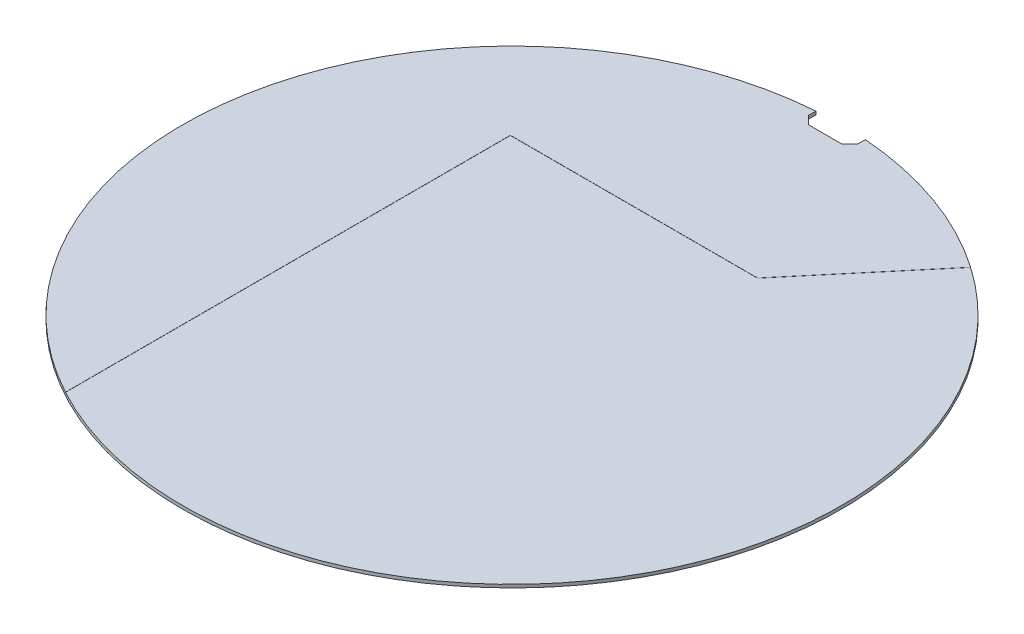
ISO-10303-21;
HEADER;
FILE_DESCRIPTION(('STEP AP214'),'2;1');
FILE_NAME('part.step','',(''),(''),'','','');
FILE_SCHEMA(('AUTOMOTIVE_DESIGN { 1 0 10303 214 1 1 1 1 }'));
ENDSEC;
DATA;
#1=APPLICATION_CONTEXT('core data for automotive mechanical design processes');
#2=APPLICATION_PROTOCOL_DEFINITION('international standard','automotive_design',2000,#1);
#3=PRODUCT_CONTEXT('',#1,'mechanical');
#4=PRODUCT('Part','Part','',(#3));
#5=PRODUCT_RELATED_PRODUCT_CATEGORY('part','',(#4));
#6=PRODUCT_DEFINITION_FORMATION('','',#4);
#7=PRODUCT_DEFINITION_CONTEXT('part definition',#1,'design');
#8=PRODUCT_DEFINITION('design','',#6,#7);
#9=PRODUCT_DEFINITION_SHAPE('','',#8);
#10=(LENGTH_UNIT() NAMED_UNIT(*) SI_UNIT(.MILLI.,.METRE.));
#11=(NAMED_UNIT(*) PLANE_ANGLE_UNIT() SI_UNIT($,.RADIAN.));
#12=(NAMED_UNIT(*) SI_UNIT($,.STERADIAN.) SOLID_ANGLE_UNIT());
#13=UNCERTAINTY_MEASURE_WITH_UNIT(LENGTH_MEASURE(1.E-05),#10,'distance_accuracy_value','');
#14=(GEOMETRIC_REPRESENTATION_CONTEXT(3) GLOBAL_UNCERTAINTY_ASSIGNED_CONTEXT((#13)) GLOBAL_UNIT_ASSIGNED_CONTEXT((#10,
#11,#12)) REPRESENTATION_CONTEXT('',''));
#15=CARTESIAN_POINT('',(0.,0.,0.));
#16=DIRECTION('',(0.,0.,1.));
#17=DIRECTION('',(1.,0.,0.));
#18=AXIS2_PLACEMENT_3D('',#15,#16,#17);
#19=CARTESIAN_POINT('',(0.,0.2,0.));
#20=DIRECTION('',(0.,-1.,0.));
#21=DIRECTION('',(0.,0.,-1.));
#22=AXIS2_PLACEMENT_3D('',#19,#20,#21);
#23=CYLINDRICAL_SURFACE('',#22,20.);
#24=CARTESIAN_POINT('',(0.,0.2,0.));
#25=DIRECTION('',(0.,1.,0.));
#26=DIRECTION('',(0.,0.,1.));
#27=AXIS2_PLACEMENT_3D('',#24,#25,#26);
#28=CIRCLE('',#27,20.);
#29=CARTESIAN_POINT('',(11.4006701364173,0.2,-16.4324289269907));
#30=VERTEX_POINT('',#29);
#31=CARTESIAN_POINT('',(1.49999999999998,0.2,-19.9436706751791));
#32=VERTEX_POINT('',#31);
#33=EDGE_CURVE('E43',#30,#32,#28,.T.);
#34=ORIENTED_EDGE('',*,*,#33,.F.);
#35=DIRECTION('',(0.,1.,0.));
#36=VECTOR('',#35,1.);
#37=CARTESIAN_POINT('',(11.4006701364173,0.19,-16.4324289269907));
#38=LINE('',#37,#36);
#39=CARTESIAN_POINT('',(11.4006701364173,0.19,-16.4324289269907));
#40=VERTEX_POINT('',#39);
#41=EDGE_CURVE('E144',#40,#30,#38,.T.);
#42=ORIENTED_EDGE('',*,*,#41,.F.);
#43=CARTESIAN_POINT('',(0.,0.19,0.));
#44=DIRECTION('',(0.,1.,0.));
#45=DIRECTION('',(0.,0.,1.));
#46=AXIS2_PLACEMENT_3D('',#43,#44,#45);
#47=CIRCLE('',#46,20.);
#48=CARTESIAN_POINT('',(-9.5,0.19,17.599715906798));
#49=VERTEX_POINT('',#48);
#50=EDGE_CURVE('E127',#49,#40,#47,.T.);
#51=ORIENTED_EDGE('',*,*,#50,.F.);
#52=DIRECTION('',(0.,1.,0.));
#53=VECTOR('',#52,1.);
#54=CARTESIAN_POINT('',(-9.5,0.19,17.599715906798));
#55=LINE('',#54,#53);
#56=CARTESIAN_POINT('',(-9.5,0.2,17.599715906798));
#57=VERTEX_POINT('',#56);
#58=EDGE_CURVE('E118',#49,#57,#55,.T.);
#59=ORIENTED_EDGE('',*,*,#58,.T.);
#60=CARTESIAN_POINT('',(-1.50000000000003,0.2,-19.9436706751791));
#61=VERTEX_POINT('',#60);
#62=EDGE_CURVE('E11',#61,#57,#28,.T.);
#63=ORIENTED_EDGE('',*,*,#62,.F.);
#64=DIRECTION('',(0.,1.,0.));
#65=VECTOR('',#64,1.);
#66=CARTESIAN_POINT('',(-1.50000000000003,0.,-19.9436706751791));
#67=LINE('',#66,#65);
#68=CARTESIAN_POINT('',(-1.50000000000003,0.,-19.9436706751791));
#69=VERTEX_POINT('',#68);
#70=EDGE_CURVE('E161',#69,#61,#67,.T.);
#71=ORIENTED_EDGE('',*,*,#70,.F.);
#72=CARTESIAN_POINT('',(0.,0.,0.));
#73=DIRECTION('',(0.,1.,0.));
#74=DIRECTION('',(0.,0.,1.));
#75=AXIS2_PLACEMENT_3D('',#72,#73,#74);
#76=CIRCLE('',#75,20.);
#77=CARTESIAN_POINT('',(1.49999999999998,0.,-19.9436706751791));
#78=VERTEX_POINT('',#77);
#79=EDGE_CURVE('E38',#69,#78,#76,.T.);
#80=ORIENTED_EDGE('',*,*,#79,.T.);
#81=DIRECTION('',(0.,1.,0.));
#82=VECTOR('',#81,1.);
#83=CARTESIAN_POINT('',(1.49999999999998,0.,-19.9436706751791));
#84=LINE('',#83,#82);
#85=EDGE_CURVE('E175',#78,#32,#84,.T.);
#86=ORIENTED_EDGE('',*,*,#85,.T.);
#87=EDGE_LOOP('',(#34,#42,#51,#59,#63,#71,#80,#86));
#88=FACE_BOUND('',#87,.T.);
#89=ADVANCED_FACE('F35',(#88),#23,.T.);
#90=CARTESIAN_POINT('',(0.,0.2,0.));
#91=DIRECTION('',(0.,1.,0.));
#92=DIRECTION('',(0.,0.,1.));
#93=AXIS2_PLACEMENT_3D('',#90,#91,#92);
#94=PLANE('',#93);
#95=DIRECTION('',(-0.642787609686537,0.,0.76604444311898));
#96=VECTOR('',#95,1.);
#97=CARTESIAN_POINT('',(-1.40120383916723,0.2,-1.17574962464941));
#98=LINE('',#97,#96);
#99=CARTESIAN_POINT('',(5.5,0.2,-9.40028409320196));
#100=VERTEX_POINT('',#99);
#101=EDGE_CURVE('E131',#30,#100,#98,.T.);
#102=ORIENTED_EDGE('',*,*,#101,.F.);
#103=ORIENTED_EDGE('',*,*,#33,.T.);
#104=DIRECTION('',(0.,0.,-1.));
#105=VECTOR('',#104,1.);
#106=CARTESIAN_POINT('',(1.49999999999997,0.2,-19.5));
#107=LINE('',#106,#105);
#108=CARTESIAN_POINT('',(1.49999999999997,0.2,-19.5));
#109=VERTEX_POINT('',#108);
#110=EDGE_CURVE('E150',#109,#32,#107,.T.);
#111=ORIENTED_EDGE('',*,*,#110,.F.);
#112=DIRECTION('',(0.707106781186549,0.,-0.707106781186546));
#113=VECTOR('',#112,1.);
#114=CARTESIAN_POINT('',(0.999999999999973,0.2,-19.));
#115=LINE('',#114,#113);
#116=CARTESIAN_POINT('',(0.999999999999973,0.2,-19.));
#117=VERTEX_POINT('',#116);
#118=EDGE_CURVE('E170',#117,#109,#115,.T.);
#119=ORIENTED_EDGE('',*,*,#118,.F.);
#120=DIRECTION('',(1.,0.,0.));
#121=VECTOR('',#120,1.);
#122=CARTESIAN_POINT('',(-1.00000000000003,0.2,-19.));
#123=LINE('',#122,#121);
#124=CARTESIAN_POINT('',(-1.00000000000003,0.2,-19.));
#125=VERTEX_POINT('',#124);
#126=EDGE_CURVE('E167',#125,#117,#123,.T.);
#127=ORIENTED_EDGE('',*,*,#126,.F.);
#128=DIRECTION('',(0.707106781186549,0.,0.707106781186547));
#129=VECTOR('',#128,1.);
#130=CARTESIAN_POINT('',(-1.50000000000003,0.2,-19.5));
#131=LINE('',#130,#129);
#132=CARTESIAN_POINT('',(-1.50000000000003,0.2,-19.5));
#133=VERTEX_POINT('',#132);
#134=EDGE_CURVE('E164',#133,#125,#131,.T.);
#135=ORIENTED_EDGE('',*,*,#134,.F.);
#136=DIRECTION('',(0.,0.,1.));
#137=VECTOR('',#136,1.);
#138=CARTESIAN_POINT('',(-1.50000000000003,0.2,-19.9436706751791));
#139=LINE('',#138,#137);
#140=EDGE_CURVE('E143',#61,#133,#139,.T.);
#141=ORIENTED_EDGE('',*,*,#140,.F.);
#142=ORIENTED_EDGE('',*,*,#62,.T.);
#143=DIRECTION('',(0.,0.,1.));
#144=VECTOR('',#143,1.);
#145=CARTESIAN_POINT('',(-9.5,0.2,0.));
#146=LINE('',#145,#144);
#147=CARTESIAN_POINT('',(-9.5,0.2,-9.40028409320196));
#148=VERTEX_POINT('',#147);
#149=EDGE_CURVE('E134',#148,#57,#146,.T.);
#150=ORIENTED_EDGE('',*,*,#149,.F.);
#151=DIRECTION('',(-1.,0.,0.));
#152=VECTOR('',#151,1.);
#153=CARTESIAN_POINT('',(0.,0.2,-9.40028409320196));
#154=LINE('',#153,#152);
#155=EDGE_CURVE('E50',#100,#148,#154,.T.);
#156=ORIENTED_EDGE('',*,*,#155,.F.);
#157=EDGE_LOOP('',(#102,#103,#111,#119,#127,#135,#141,#142,#150,#156));
#158=FACE_BOUND('',#157,.T.);
#159=ADVANCED_FACE('F197',(#158),#94,.T.);
#160=CARTESIAN_POINT('',(0.,0.,0.));
#161=DIRECTION('',(0.,1.,0.));
#162=DIRECTION('',(0.,0.,1.));
#163=AXIS2_PLACEMENT_3D('',#160,#161,#162);
#164=PLANE('',#163);
#165=DIRECTION('',(0.707106781186549,0.,-0.707106781186546));
#166=VECTOR('',#165,1.);
#167=CARTESIAN_POINT('',(0.999999999999973,0.,-19.));
#168=LINE('',#167,#166);
#169=CARTESIAN_POINT('',(0.999999999999973,0.,-19.));
#170=VERTEX_POINT('',#169);
#171=CARTESIAN_POINT('',(1.49999999999997,0.,-19.5));
#172=VERTEX_POINT('',#171);
#173=EDGE_CURVE('E155',#170,#172,#168,.T.);
#174=ORIENTED_EDGE('',*,*,#173,.T.);
#175=DIRECTION('',(0.,0.,-1.));
#176=VECTOR('',#175,1.);
#177=CARTESIAN_POINT('',(1.49999999999997,0.,-19.5));
#178=LINE('',#177,#176);
#179=EDGE_CURVE('E158',#172,#78,#178,.T.);
#180=ORIENTED_EDGE('',*,*,#179,.T.);
#181=ORIENTED_EDGE('',*,*,#79,.F.);
#182=DIRECTION('',(0.,0.,1.));
#183=VECTOR('',#182,1.);
#184=CARTESIAN_POINT('',(-1.50000000000003,0.,-19.9436706751791));
#185=LINE('',#184,#183);
#186=CARTESIAN_POINT('',(-1.50000000000003,0.,-19.5));
#187=VERTEX_POINT('',#186);
#188=EDGE_CURVE('E147',#69,#187,#185,.T.);
#189=ORIENTED_EDGE('',*,*,#188,.T.);
#190=DIRECTION('',(0.707106781186549,0.,0.707106781186547));
#191=VECTOR('',#190,1.);
#192=CARTESIAN_POINT('',(-1.50000000000003,0.,-19.5));
#193=LINE('',#192,#191);
#194=CARTESIAN_POINT('',(-1.00000000000003,0.,-19.));
#195=VERTEX_POINT('',#194);
#196=EDGE_CURVE('E58',#187,#195,#193,.T.);
#197=ORIENTED_EDGE('',*,*,#196,.T.);
#198=DIRECTION('',(1.,0.,0.));
#199=VECTOR('',#198,1.);
#200=CARTESIAN_POINT('',(-1.00000000000003,0.,-19.));
#201=LINE('',#200,#199);
#202=EDGE_CURVE('E152',#195,#170,#201,.T.);
#203=ORIENTED_EDGE('',*,*,#202,.T.);
#204=EDGE_LOOP('',(#174,#180,#181,#189,#197,#203));
#205=FACE_BOUND('',#204,.T.);
#206=ADVANCED_FACE('F205',(#205),#164,.F.);
#207=CARTESIAN_POINT('',(1.49999999999997,0.,-19.5));
#208=DIRECTION('',(1.,0.,0.));
#209=DIRECTION('',(0.,0.,-1.));
#210=AXIS2_PLACEMENT_3D('',#207,#208,#209);
#211=PLANE('',#210);
#212=ORIENTED_EDGE('',*,*,#110,.T.);
#213=ORIENTED_EDGE('',*,*,#85,.F.);
#214=ORIENTED_EDGE('',*,*,#179,.F.);
#215=DIRECTION('',(0.,1.,0.));
#216=VECTOR('',#215,1.);
#217=CARTESIAN_POINT('',(1.49999999999997,0.,-19.5));
#218=LINE('',#217,#216);
#219=EDGE_CURVE('E178',#172,#109,#218,.T.);
#220=ORIENTED_EDGE('',*,*,#219,.T.);
#221=EDGE_LOOP('',(#212,#213,#214,#220));
#222=FACE_BOUND('',#221,.T.);
#223=ADVANCED_FACE('F209',(#222),#211,.F.);
#224=CARTESIAN_POINT('',(0.999999999999973,0.,-19.));
#225=DIRECTION('',(0.707106781186546,0.,0.707106781186549));
#226=DIRECTION('',(0.707106781186549,0.,-0.707106781186546));
#227=AXIS2_PLACEMENT_3D('',#224,#225,#226);
#228=PLANE('',#227);
#229=ORIENTED_EDGE('',*,*,#118,.T.);
#230=ORIENTED_EDGE('',*,*,#219,.F.);
#231=ORIENTED_EDGE('',*,*,#173,.F.);
#232=DIRECTION('',(0.,1.,0.));
#233=VECTOR('',#232,1.);
#234=CARTESIAN_POINT('',(0.999999999999973,0.,-19.));
#235=LINE('',#234,#233);
#236=EDGE_CURVE('E180',#170,#117,#235,.T.);
#237=ORIENTED_EDGE('',*,*,#236,.T.);
#238=EDGE_LOOP('',(#229,#230,#231,#237));
#239=FACE_BOUND('',#238,.T.);
#240=ADVANCED_FACE('F212',(#239),#228,.F.);
#241=CARTESIAN_POINT('',(-1.00000000000003,0.,-19.));
#242=DIRECTION('',(0.,0.,1.));
#243=DIRECTION('',(1.,0.,0.));
#244=AXIS2_PLACEMENT_3D('',#241,#242,#243);
#245=PLANE('',#244);
#246=ORIENTED_EDGE('',*,*,#126,.T.);
#247=ORIENTED_EDGE('',*,*,#236,.F.);
#248=ORIENTED_EDGE('',*,*,#202,.F.);
#249=DIRECTION('',(0.,1.,0.));
#250=VECTOR('',#249,1.);
#251=CARTESIAN_POINT('',(-1.00000000000003,0.,-19.));
#252=LINE('',#251,#250);
#253=EDGE_CURVE('E182',#195,#125,#252,.T.);
#254=ORIENTED_EDGE('',*,*,#253,.T.);
#255=EDGE_LOOP('',(#246,#247,#248,#254));
#256=FACE_BOUND('',#255,.T.);
#257=ADVANCED_FACE('F215',(#256),#245,.F.);
#258=CARTESIAN_POINT('',(-1.50000000000003,0.,-19.5));
#259=DIRECTION('',(-0.707106781186547,0.,0.707106781186548));
#260=DIRECTION('',(0.707106781186548,0.,0.707106781186547));
#261=AXIS2_PLACEMENT_3D('',#258,#259,#260);
#262=PLANE('',#261);
#263=ORIENTED_EDGE('',*,*,#134,.T.);
#264=ORIENTED_EDGE('',*,*,#253,.F.);
#265=ORIENTED_EDGE('',*,*,#196,.F.);
#266=DIRECTION('',(0.,1.,0.));
#267=VECTOR('',#266,1.);
#268=CARTESIAN_POINT('',(-1.50000000000003,0.,-19.5));
#269=LINE('',#268,#267);
#270=EDGE_CURVE('E184',#187,#133,#269,.T.);
#271=ORIENTED_EDGE('',*,*,#270,.T.);
#272=EDGE_LOOP('',(#263,#264,#265,#271));
#273=FACE_BOUND('',#272,.T.);
#274=ADVANCED_FACE('F216',(#273),#262,.F.);
#275=CARTESIAN_POINT('',(-1.50000000000003,0.,-19.9436706751791));
#276=DIRECTION('',(-1.,0.,0.));
#277=DIRECTION('',(0.,0.,1.));
#278=AXIS2_PLACEMENT_3D('',#275,#276,#277);
#279=PLANE('',#278);
#280=ORIENTED_EDGE('',*,*,#140,.T.);
#281=ORIENTED_EDGE('',*,*,#270,.F.);
#282=ORIENTED_EDGE('',*,*,#188,.F.);
#283=ORIENTED_EDGE('',*,*,#70,.T.);
#284=EDGE_LOOP('',(#280,#281,#282,#283));
#285=FACE_BOUND('',#284,.T.);
#286=ADVANCED_FACE('F189',(#285),#279,.F.);
#287=CARTESIAN_POINT('',(0.,0.19,-9.40028409320196));
#288=DIRECTION('',(0.,0.,-1.));
#289=DIRECTION('',(-1.,0.,0.));
#290=AXIS2_PLACEMENT_3D('',#287,#288,#289);
#291=PLANE('',#290);
#292=ORIENTED_EDGE('',*,*,#155,.T.);
#293=DIRECTION('',(0.,1.,0.));
#294=VECTOR('',#293,1.);
#295=CARTESIAN_POINT('',(-9.5,0.19,-9.40028409320196));
#296=LINE('',#295,#294);
#297=CARTESIAN_POINT('',(-9.5,0.19,-9.40028409320196));
#298=VERTEX_POINT('',#297);
#299=EDGE_CURVE('E110',#298,#148,#296,.T.);
#300=ORIENTED_EDGE('',*,*,#299,.F.);
#301=DIRECTION('',(-1.,0.,0.));
#302=VECTOR('',#301,1.);
#303=CARTESIAN_POINT('',(0.,0.19,-9.40028409320196));
#304=LINE('',#303,#302);
#305=CARTESIAN_POINT('',(5.5,0.19,-9.40028409320196));
#306=VERTEX_POINT('',#305);
#307=EDGE_CURVE('E114',#306,#298,#304,.T.);
#308=ORIENTED_EDGE('',*,*,#307,.F.);
#309=DIRECTION('',(0.,1.,0.));
#310=VECTOR('',#309,1.);
#311=CARTESIAN_POINT('',(5.5,0.19,-9.40028409320196));
#312=LINE('',#311,#310);
#313=EDGE_CURVE('E141',#306,#100,#312,.T.);
#314=ORIENTED_EDGE('',*,*,#313,.T.);
#315=EDGE_LOOP('',(#292,#300,#308,#314));
#316=FACE_BOUND('',#315,.T.);
#317=ADVANCED_FACE('F112',(#316),#291,.F.);
#318=CARTESIAN_POINT('',(-1.40120383916723,0.19,-1.17574962464941));
#319=DIRECTION('',(-0.76604444311898,0.,-0.642787609686537));
#320=DIRECTION('',(-0.642787609686537,0.,0.76604444311898));
#321=AXIS2_PLACEMENT_3D('',#318,#319,#320);
#322=PLANE('',#321);
#323=ORIENTED_EDGE('',*,*,#101,.T.);
#324=ORIENTED_EDGE('',*,*,#313,.F.);
#325=DIRECTION('',(-0.642787609686537,0.,0.76604444311898));
#326=VECTOR('',#325,1.);
#327=CARTESIAN_POINT('',(-1.40120383916723,0.19,-1.17574962464941));
#328=LINE('',#327,#326);
#329=EDGE_CURVE('E119',#40,#306,#328,.T.);
#330=ORIENTED_EDGE('',*,*,#329,.F.);
#331=ORIENTED_EDGE('',*,*,#41,.T.);
#332=EDGE_LOOP('',(#323,#324,#330,#331));
#333=FACE_BOUND('',#332,.T.);
#334=ADVANCED_FACE('F202',(#333),#322,.F.);
#335=CARTESIAN_POINT('',(-9.5,0.19,0.));
#336=DIRECTION('',(-1.,0.,0.));
#337=DIRECTION('',(0.,0.,1.));
#338=AXIS2_PLACEMENT_3D('',#335,#336,#337);
#339=PLANE('',#338);
#340=ORIENTED_EDGE('',*,*,#149,.T.);
#341=ORIENTED_EDGE('',*,*,#58,.F.);
#342=DIRECTION('',(0.,0.,1.));
#343=VECTOR('',#342,1.);
#344=CARTESIAN_POINT('',(-9.5,0.19,0.));
#345=LINE('',#344,#343);
#346=EDGE_CURVE('E122',#298,#49,#345,.T.);
#347=ORIENTED_EDGE('',*,*,#346,.F.);
#348=ORIENTED_EDGE('',*,*,#299,.T.);
#349=EDGE_LOOP('',(#340,#341,#347,#348));
#350=FACE_BOUND('',#349,.T.);
#351=ADVANCED_FACE('F123',(#350),#339,.F.);
#352=CARTESIAN_POINT('',(0.,0.19,0.));
#353=DIRECTION('',(0.,1.,0.));
#354=DIRECTION('',(0.,0.,1.));
#355=AXIS2_PLACEMENT_3D('',#352,#353,#354);
#356=PLANE('',#355);
#357=ORIENTED_EDGE('',*,*,#307,.T.);
#358=ORIENTED_EDGE('',*,*,#346,.T.);
#359=ORIENTED_EDGE('',*,*,#50,.T.);
#360=ORIENTED_EDGE('',*,*,#329,.T.);
#361=EDGE_LOOP('',(#357,#358,#359,#360));
#362=FACE_BOUND('',#361,.T.);
#363=ADVANCED_FACE('F129',(#362),#356,.T.);
#364=CLOSED_SHELL('',(#89,#159,#206,#223,#240,#257,#274,#286,#317,#334,#351,#363));
#365=MANIFOLD_SOLID_BREP('B2',#364);
#366=ADVANCED_BREP_SHAPE_REPRESENTATION('',(#18,#365),#14);
#367=SHAPE_DEFINITION_REPRESENTATION(#9,#366);
ENDSEC;
END-ISO-10303-21;
